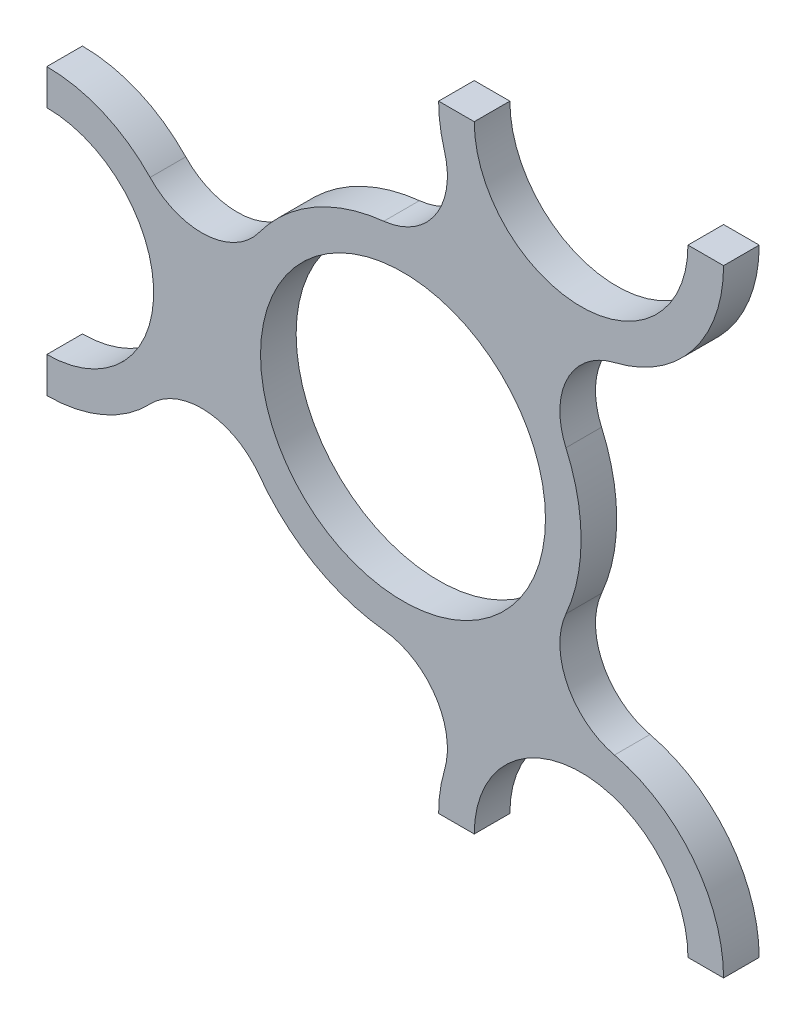
ISO-10303-21;
HEADER;
FILE_DESCRIPTION(('STEP AP214'),'2;1');
FILE_NAME('part.step','',(''),(''),'','','');
FILE_SCHEMA(('AUTOMOTIVE_DESIGN { 1 0 10303 214 1 1 1 1 }'));
ENDSEC;
DATA;
#1=APPLICATION_CONTEXT('core data for automotive mechanical design processes');
#2=APPLICATION_PROTOCOL_DEFINITION('international standard','automotive_design',2000,#1);
#3=PRODUCT_CONTEXT('',#1,'mechanical');
#4=PRODUCT('Part','Part','',(#3));
#5=PRODUCT_RELATED_PRODUCT_CATEGORY('part','',(#4));
#6=PRODUCT_DEFINITION_FORMATION('','',#4);
#7=PRODUCT_DEFINITION_CONTEXT('part definition',#1,'design');
#8=PRODUCT_DEFINITION('design','',#6,#7);
#9=PRODUCT_DEFINITION_SHAPE('','',#8);
#10=(LENGTH_UNIT() NAMED_UNIT(*) SI_UNIT(.MILLI.,.METRE.));
#11=(NAMED_UNIT(*) PLANE_ANGLE_UNIT() SI_UNIT($,.RADIAN.));
#12=(NAMED_UNIT(*) SI_UNIT($,.STERADIAN.) SOLID_ANGLE_UNIT());
#13=UNCERTAINTY_MEASURE_WITH_UNIT(LENGTH_MEASURE(1.E-05),#10,'distance_accuracy_value','');
#14=(GEOMETRIC_REPRESENTATION_CONTEXT(3) GLOBAL_UNCERTAINTY_ASSIGNED_CONTEXT((#13)) GLOBAL_UNIT_ASSIGNED_CONTEXT((#10,
#11,#12)) REPRESENTATION_CONTEXT('',''));
#15=CARTESIAN_POINT('',(0.,0.,0.));
#16=DIRECTION('',(0.,0.,1.));
#17=DIRECTION('',(1.,0.,0.));
#18=AXIS2_PLACEMENT_3D('',#15,#16,#17);
#19=CARTESIAN_POINT('',(-2.6495198984339,86.6,10.));
#20=DIRECTION('',(0.,0.,1.));
#21=DIRECTION('',(1.,0.,0.));
#22=AXIS2_PLACEMENT_3D('',#19,#20,#21);
#23=PLANE('',#22);
#24=CARTESIAN_POINT('',(-2.6495198984339,86.6,10.));
#25=DIRECTION('',(0.,0.,1.));
#26=DIRECTION('',(1.,0.,0.));
#27=AXIS2_PLACEMENT_3D('',#24,#25,#26);
#28=CIRCLE('',#27,40.);
#29=CARTESIAN_POINT('',(6.7101164463444,47.7104486077108,10.));
#30=VERTEX_POINT('',#29);
#31=CARTESIAN_POINT('',(37.3504801015661,86.6,10.));
#32=VERTEX_POINT('',#31);
#33=EDGE_CURVE('E276',#30,#32,#28,.T.);
#34=ORIENTED_EDGE('',*,*,#33,.T.);
#35=DIRECTION('',(-1.,0.,0.));
#36=VECTOR('',#35,1.);
#37=CARTESIAN_POINT('',(27.3504801015661,86.6,10.));
#38=LINE('',#37,#36);
#39=CARTESIAN_POINT('',(27.3504801015661,86.6,10.));
#40=VERTEX_POINT('',#39);
#41=EDGE_CURVE('E144',#32,#40,#38,.T.);
#42=ORIENTED_EDGE('',*,*,#41,.T.);
#43=CARTESIAN_POINT('',(-2.6495198984339,86.6,10.));
#44=DIRECTION('',(0.,0.,-1.));
#45=DIRECTION('',(1.,0.,0.));
#46=AXIS2_PLACEMENT_3D('',#43,#44,#45);
#47=CIRCLE('',#46,30.);
#48=CARTESIAN_POINT('',(-32.6495198984339,86.6,10.));
#49=VERTEX_POINT('',#48);
#50=EDGE_CURVE('E339',#40,#49,#47,.T.);
#51=ORIENTED_EDGE('',*,*,#50,.T.);
#52=DIRECTION('',(-1.,0.,0.));
#53=VECTOR('',#52,1.);
#54=CARTESIAN_POINT('',(-42.6495198984339,86.6,10.));
#55=LINE('',#54,#53);
#56=CARTESIAN_POINT('',(-42.6495198984339,86.6,10.));
#57=VERTEX_POINT('',#56);
#58=EDGE_CURVE('E358',#49,#57,#55,.T.);
#59=ORIENTED_EDGE('',*,*,#58,.T.);
#60=CARTESIAN_POINT('',(-2.6495198984339,86.6,10.));
#61=DIRECTION('',(0.,0.,1.));
#62=DIRECTION('',(1.,0.,0.));
#63=AXIS2_PLACEMENT_3D('',#60,#61,#62);
#64=CIRCLE('',#63,40.);
#65=CARTESIAN_POINT('',(-41.0089655681558,75.2618816414869,10.));
#66=VERTEX_POINT('',#65);
#67=EDGE_CURVE('E355',#57,#66,#64,.T.);
#68=ORIENTED_EDGE('',*,*,#67,.T.);
#69=CARTESIAN_POINT('',(-60.1886884030168,69.5928224622303,10.));
#70=DIRECTION('',(0.,0.,-1.));
#71=DIRECTION('',(1.,0.,0.));
#72=AXIS2_PLACEMENT_3D('',#69,#70,#71);
#73=CIRCLE('',#72,20.);
#74=CARTESIAN_POINT('',(-58.0346402588503,49.7091589015931,10.));
#75=VERTEX_POINT('',#74);
#76=EDGE_CURVE('E357',#66,#75,#73,.T.);
#77=ORIENTED_EDGE('',*,*,#76,.T.);
#78=CARTESIAN_POINT('',(-52.6495198984339,0.,10.));
#79=DIRECTION('',(0.,0.,1.));
#80=DIRECTION('',(1.,0.,0.));
#81=AXIS2_PLACEMENT_3D('',#78,#79,#80);
#82=CIRCLE('',#81,50.);
#83=CARTESIAN_POINT('',(-93.0066627555767,29.5178085299055,10.));
#84=VERTEX_POINT('',#83);
#85=EDGE_CURVE('E360',#75,#84,#82,.T.);
#86=ORIENTED_EDGE('',*,*,#85,.T.);
#87=CARTESIAN_POINT('',(-109.149519898434,41.3249319418678,10.));
#88=DIRECTION('',(0.,0.,-1.));
#89=DIRECTION('',(1.,0.,0.));
#90=AXIS2_PLACEMENT_3D('',#87,#88,#89);
#91=CIRCLE('',#90,20.);
#92=CARTESIAN_POINT('',(-123.649519898434,27.5499546279118,10.));
#93=VERTEX_POINT('',#92);
#94=EDGE_CURVE('E366',#84,#93,#91,.T.);
#95=ORIENTED_EDGE('',*,*,#94,.T.);
#96=CARTESIAN_POINT('',(-152.649519898434,0.,10.));
#97=DIRECTION('',(0.,0.,1.));
#98=DIRECTION('',(1.,0.,0.));
#99=AXIS2_PLACEMENT_3D('',#96,#97,#98);
#100=CIRCLE('',#99,40.);
#101=CARTESIAN_POINT('',(-152.649519898434,40.,10.));
#102=VERTEX_POINT('',#101);
#103=EDGE_CURVE('E368',#93,#102,#100,.T.);
#104=ORIENTED_EDGE('',*,*,#103,.T.);
#105=DIRECTION('',(0.,-1.,0.));
#106=VECTOR('',#105,1.);
#107=CARTESIAN_POINT('',(-152.649519898434,40.,10.));
#108=LINE('',#107,#106);
#109=CARTESIAN_POINT('',(-152.649519898434,30.,10.));
#110=VERTEX_POINT('',#109);
#111=EDGE_CURVE('E370',#102,#110,#108,.T.);
#112=ORIENTED_EDGE('',*,*,#111,.T.);
#113=CARTESIAN_POINT('',(-152.649519898434,0.,10.));
#114=DIRECTION('',(0.,0.,-1.));
#115=DIRECTION('',(1.,0.,0.));
#116=AXIS2_PLACEMENT_3D('',#113,#114,#115);
#117=CIRCLE('',#116,30.);
#118=CARTESIAN_POINT('',(-152.649519898434,-30.,10.));
#119=VERTEX_POINT('',#118);
#120=EDGE_CURVE('E372',#110,#119,#117,.T.);
#121=ORIENTED_EDGE('',*,*,#120,.T.);
#122=DIRECTION('',(0.,-1.,0.));
#123=VECTOR('',#122,1.);
#124=CARTESIAN_POINT('',(-152.649519898434,-30.,10.));
#125=LINE('',#124,#123);
#126=CARTESIAN_POINT('',(-152.649519898434,-40.,10.));
#127=VERTEX_POINT('',#126);
#128=EDGE_CURVE('E374',#119,#127,#125,.T.);
#129=ORIENTED_EDGE('',*,*,#128,.T.);
#130=CARTESIAN_POINT('',(-152.649519898434,0.,10.));
#131=DIRECTION('',(0.,0.,1.));
#132=DIRECTION('',(1.,0.,0.));
#133=AXIS2_PLACEMENT_3D('',#130,#131,#132);
#134=CIRCLE('',#133,40.);
#135=CARTESIAN_POINT('',(-123.649519898434,-27.5499546279118,10.));
#136=VERTEX_POINT('',#135);
#137=EDGE_CURVE('E376',#127,#136,#134,.T.);
#138=ORIENTED_EDGE('',*,*,#137,.T.);
#139=CARTESIAN_POINT('',(-109.149519898434,-41.3249319418678,10.));
#140=DIRECTION('',(0.,0.,-1.));
#141=DIRECTION('',(1.,0.,0.));
#142=AXIS2_PLACEMENT_3D('',#139,#140,#141);
#143=CIRCLE('',#142,20.);
#144=CARTESIAN_POINT('',(-93.0066627555767,-29.5178085299055,10.));
#145=VERTEX_POINT('',#144);
#146=EDGE_CURVE('E378',#136,#145,#143,.T.);
#147=ORIENTED_EDGE('',*,*,#146,.T.);
#148=CARTESIAN_POINT('',(-52.6495198984339,0.,10.));
#149=DIRECTION('',(0.,0.,1.));
#150=DIRECTION('',(1.,0.,0.));
#151=AXIS2_PLACEMENT_3D('',#148,#149,#150);
#152=CIRCLE('',#151,50.);
#153=CARTESIAN_POINT('',(-58.0346402588503,-49.7091589015931,10.));
#154=VERTEX_POINT('',#153);
#155=EDGE_CURVE('E380',#145,#154,#152,.T.);
#156=ORIENTED_EDGE('',*,*,#155,.T.);
#157=CARTESIAN_POINT('',(-60.1886884030168,-69.5928224622303,10.));
#158=DIRECTION('',(0.,0.,-1.));
#159=DIRECTION('',(-1.,0.,0.));
#160=AXIS2_PLACEMENT_3D('',#157,#158,#159);
#161=CIRCLE('',#160,20.);
#162=CARTESIAN_POINT('',(-41.0089655681558,-75.2618816414869,10.));
#163=VERTEX_POINT('',#162);
#164=EDGE_CURVE('E382',#154,#163,#161,.T.);
#165=ORIENTED_EDGE('',*,*,#164,.T.);
#166=CARTESIAN_POINT('',(-2.6495198984339,-86.6,10.));
#167=DIRECTION('',(0.,0.,1.));
#168=DIRECTION('',(-1.,0.,0.));
#169=AXIS2_PLACEMENT_3D('',#166,#167,#168);
#170=CIRCLE('',#169,40.);
#171=CARTESIAN_POINT('',(-42.6495198984339,-86.6,10.));
#172=VERTEX_POINT('',#171);
#173=EDGE_CURVE('E384',#163,#172,#170,.T.);
#174=ORIENTED_EDGE('',*,*,#173,.T.);
#175=DIRECTION('',(1.,0.,0.));
#176=VECTOR('',#175,1.);
#177=CARTESIAN_POINT('',(-42.6495198984339,-86.6,10.));
#178=LINE('',#177,#176);
#179=CARTESIAN_POINT('',(-32.6495198984339,-86.6,10.));
#180=VERTEX_POINT('',#179);
#181=EDGE_CURVE('E386',#172,#180,#178,.T.);
#182=ORIENTED_EDGE('',*,*,#181,.T.);
#183=CARTESIAN_POINT('',(-2.6495198984339,-86.6,10.));
#184=DIRECTION('',(0.,0.,-1.));
#185=DIRECTION('',(-1.,0.,0.));
#186=AXIS2_PLACEMENT_3D('',#183,#184,#185);
#187=CIRCLE('',#186,30.);
#188=CARTESIAN_POINT('',(27.3504801015661,-86.6,10.));
#189=VERTEX_POINT('',#188);
#190=EDGE_CURVE('E388',#180,#189,#187,.T.);
#191=ORIENTED_EDGE('',*,*,#190,.T.);
#192=DIRECTION('',(1.,0.,0.));
#193=VECTOR('',#192,1.);
#194=CARTESIAN_POINT('',(27.3504801015661,-86.6,10.));
#195=LINE('',#194,#193);
#196=CARTESIAN_POINT('',(37.3504801015661,-86.6,10.));
#197=VERTEX_POINT('',#196);
#198=EDGE_CURVE('E390',#189,#197,#195,.T.);
#199=ORIENTED_EDGE('',*,*,#198,.T.);
#200=CARTESIAN_POINT('',(-2.6495198984339,-86.6,10.));
#201=DIRECTION('',(0.,0.,1.));
#202=DIRECTION('',(-1.,0.,0.));
#203=AXIS2_PLACEMENT_3D('',#200,#201,#202);
#204=CIRCLE('',#203,40.);
#205=CARTESIAN_POINT('',(6.71011644634439,-47.7104486077108,10.));
#206=VERTEX_POINT('',#205);
#207=EDGE_CURVE('E211',#197,#206,#204,.T.);
#208=ORIENTED_EDGE('',*,*,#207,.T.);
#209=CARTESIAN_POINT('',(11.3899346187335,-28.2656729115661,10.));
#210=DIRECTION('',(0.,0.,-1.));
#211=DIRECTION('',(-1.,0.,0.));
#212=AXIS2_PLACEMENT_3D('',#209,#210,#211);
#213=CIRCLE('',#212,20.);
#214=CARTESIAN_POINT('',(-6.90705238617144,-20.1897663654044,10.));
#215=VERTEX_POINT('',#214);
#216=EDGE_CURVE('E205',#206,#215,#213,.T.);
#217=ORIENTED_EDGE('',*,*,#216,.T.);
#218=CARTESIAN_POINT('',(-52.6495198984339,0.,10.));
#219=DIRECTION('',(0.,0.,1.));
#220=DIRECTION('',(1.,0.,0.));
#221=AXIS2_PLACEMENT_3D('',#218,#219,#220);
#222=CIRCLE('',#221,50.);
#223=CARTESIAN_POINT('',(-6.90705238617144,20.1897663654044,10.));
#224=VERTEX_POINT('',#223);
#225=EDGE_CURVE('E209',#215,#224,#222,.T.);
#226=ORIENTED_EDGE('',*,*,#225,.T.);
#227=CARTESIAN_POINT('',(11.3899346187335,28.2656729115661,10.));
#228=DIRECTION('',(0.,0.,-1.));
#229=DIRECTION('',(1.,0.,0.));
#230=AXIS2_PLACEMENT_3D('',#227,#228,#229);
#231=CIRCLE('',#230,20.);
#232=EDGE_CURVE('E53',#224,#30,#231,.T.);
#233=ORIENTED_EDGE('',*,*,#232,.T.);
#234=EDGE_LOOP('',(#34,#42,#51,#59,#68,#77,#86,#95,#104,#112,#121,#129,#138,#147,#156,#165,#174,
#182,#191,#199,#208,#217,#226,#233));
#235=FACE_BOUND('',#234,.T.);
#236=CARTESIAN_POINT('',(-52.6495198984339,0.,10.));
#237=DIRECTION('',(0.,0.,1.));
#238=DIRECTION('',(1.,0.,0.));
#239=AXIS2_PLACEMENT_3D('',#236,#237,#238);
#240=CIRCLE('',#239,40.);
#241=CARTESIAN_POINT('',(-12.6495198984339,0.,10.));
#242=VERTEX_POINT('',#241);
#243=EDGE_CURVE('E233',#242,#242,#240,.T.);
#244=ORIENTED_EDGE('',*,*,#243,.F.);
#245=EDGE_LOOP('',(#244));
#246=FACE_BOUND('',#245,.T.);
#247=ADVANCED_FACE('F36',(#235,#246),#23,.T.);
#248=CARTESIAN_POINT('',(-2.6495198984339,86.6,0.));
#249=DIRECTION('',(0.,0.,1.));
#250=DIRECTION('',(1.,0.,0.));
#251=AXIS2_PLACEMENT_3D('',#248,#249,#250);
#252=PLANE('',#251);
#253=CARTESIAN_POINT('',(-2.6495198984339,86.6,0.));
#254=DIRECTION('',(0.,0.,1.));
#255=DIRECTION('',(1.,0.,0.));
#256=AXIS2_PLACEMENT_3D('',#253,#254,#255);
#257=CIRCLE('',#256,40.);
#258=CARTESIAN_POINT('',(6.7101164463444,47.7104486077108,0.));
#259=VERTEX_POINT('',#258);
#260=CARTESIAN_POINT('',(37.3504801015661,86.6,0.));
#261=VERTEX_POINT('',#260);
#262=EDGE_CURVE('E229',#259,#261,#257,.T.);
#263=ORIENTED_EDGE('',*,*,#262,.F.);
#264=CARTESIAN_POINT('',(11.3899346187335,28.2656729115661,0.));
#265=DIRECTION('',(0.,0.,-1.));
#266=DIRECTION('',(1.,0.,0.));
#267=AXIS2_PLACEMENT_3D('',#264,#265,#266);
#268=CIRCLE('',#267,20.);
#269=CARTESIAN_POINT('',(-6.90705238617144,20.1897663654044,0.));
#270=VERTEX_POINT('',#269);
#271=EDGE_CURVE('E136',#270,#259,#268,.T.);
#272=ORIENTED_EDGE('',*,*,#271,.F.);
#273=CARTESIAN_POINT('',(-52.6495198984339,0.,0.));
#274=DIRECTION('',(0.,0.,1.));
#275=DIRECTION('',(1.,0.,0.));
#276=AXIS2_PLACEMENT_3D('',#273,#274,#275);
#277=CIRCLE('',#276,50.);
#278=CARTESIAN_POINT('',(-6.90705238617144,-20.1897663654044,0.));
#279=VERTEX_POINT('',#278);
#280=EDGE_CURVE('E130',#279,#270,#277,.T.);
#281=ORIENTED_EDGE('',*,*,#280,.F.);
#282=CARTESIAN_POINT('',(11.3899346187335,-28.2656729115661,0.));
#283=DIRECTION('',(0.,0.,-1.));
#284=DIRECTION('',(-1.,0.,0.));
#285=AXIS2_PLACEMENT_3D('',#282,#283,#284);
#286=CIRCLE('',#285,20.);
#287=CARTESIAN_POINT('',(6.71011644634439,-47.7104486077108,0.));
#288=VERTEX_POINT('',#287);
#289=EDGE_CURVE('E219',#288,#279,#286,.T.);
#290=ORIENTED_EDGE('',*,*,#289,.F.);
#291=CARTESIAN_POINT('',(-2.6495198984339,-86.6,0.));
#292=DIRECTION('',(0.,0.,1.));
#293=DIRECTION('',(-1.,0.,0.));
#294=AXIS2_PLACEMENT_3D('',#291,#292,#293);
#295=CIRCLE('',#294,40.);
#296=CARTESIAN_POINT('',(37.3504801015661,-86.6,0.));
#297=VERTEX_POINT('',#296);
#298=EDGE_CURVE('E271',#297,#288,#295,.T.);
#299=ORIENTED_EDGE('',*,*,#298,.F.);
#300=DIRECTION('',(1.,0.,0.));
#301=VECTOR('',#300,1.);
#302=CARTESIAN_POINT('',(27.3504801015661,-86.6,0.));
#303=LINE('',#302,#301);
#304=CARTESIAN_POINT('',(27.3504801015661,-86.6,0.));
#305=VERTEX_POINT('',#304);
#306=EDGE_CURVE('E269',#305,#297,#303,.T.);
#307=ORIENTED_EDGE('',*,*,#306,.F.);
#308=CARTESIAN_POINT('',(-2.6495198984339,-86.6,0.));
#309=DIRECTION('',(0.,0.,-1.));
#310=DIRECTION('',(-1.,0.,0.));
#311=AXIS2_PLACEMENT_3D('',#308,#309,#310);
#312=CIRCLE('',#311,30.);
#313=CARTESIAN_POINT('',(-32.6495198984339,-86.6,0.));
#314=VERTEX_POINT('',#313);
#315=EDGE_CURVE('E267',#314,#305,#312,.T.);
#316=ORIENTED_EDGE('',*,*,#315,.F.);
#317=DIRECTION('',(1.,0.,0.));
#318=VECTOR('',#317,1.);
#319=CARTESIAN_POINT('',(-42.6495198984339,-86.6,0.));
#320=LINE('',#319,#318);
#321=CARTESIAN_POINT('',(-42.6495198984339,-86.6,0.));
#322=VERTEX_POINT('',#321);
#323=EDGE_CURVE('E265',#322,#314,#320,.T.);
#324=ORIENTED_EDGE('',*,*,#323,.F.);
#325=CARTESIAN_POINT('',(-2.6495198984339,-86.6,0.));
#326=DIRECTION('',(0.,0.,1.));
#327=DIRECTION('',(-1.,0.,0.));
#328=AXIS2_PLACEMENT_3D('',#325,#326,#327);
#329=CIRCLE('',#328,40.);
#330=CARTESIAN_POINT('',(-41.0089655681558,-75.2618816414869,0.));
#331=VERTEX_POINT('',#330);
#332=EDGE_CURVE('E263',#331,#322,#329,.T.);
#333=ORIENTED_EDGE('',*,*,#332,.F.);
#334=CARTESIAN_POINT('',(-60.1886884030168,-69.5928224622303,0.));
#335=DIRECTION('',(0.,0.,-1.));
#336=DIRECTION('',(-1.,0.,0.));
#337=AXIS2_PLACEMENT_3D('',#334,#335,#336);
#338=CIRCLE('',#337,20.);
#339=CARTESIAN_POINT('',(-58.0346402588503,-49.7091589015931,0.));
#340=VERTEX_POINT('',#339);
#341=EDGE_CURVE('E261',#340,#331,#338,.T.);
#342=ORIENTED_EDGE('',*,*,#341,.F.);
#343=CARTESIAN_POINT('',(-52.6495198984339,0.,0.));
#344=DIRECTION('',(0.,0.,1.));
#345=DIRECTION('',(1.,0.,0.));
#346=AXIS2_PLACEMENT_3D('',#343,#344,#345);
#347=CIRCLE('',#346,50.);
#348=CARTESIAN_POINT('',(-93.0066627555767,-29.5178085299055,0.));
#349=VERTEX_POINT('',#348);
#350=EDGE_CURVE('E259',#349,#340,#347,.T.);
#351=ORIENTED_EDGE('',*,*,#350,.F.);
#352=CARTESIAN_POINT('',(-109.149519898434,-41.3249319418678,0.));
#353=DIRECTION('',(0.,0.,-1.));
#354=DIRECTION('',(1.,0.,0.));
#355=AXIS2_PLACEMENT_3D('',#352,#353,#354);
#356=CIRCLE('',#355,20.);
#357=CARTESIAN_POINT('',(-123.649519898434,-27.5499546279118,0.));
#358=VERTEX_POINT('',#357);
#359=EDGE_CURVE('E257',#358,#349,#356,.T.);
#360=ORIENTED_EDGE('',*,*,#359,.F.);
#361=CARTESIAN_POINT('',(-152.649519898434,0.,0.));
#362=DIRECTION('',(0.,0.,1.));
#363=DIRECTION('',(1.,0.,0.));
#364=AXIS2_PLACEMENT_3D('',#361,#362,#363);
#365=CIRCLE('',#364,40.);
#366=CARTESIAN_POINT('',(-152.649519898434,-40.,0.));
#367=VERTEX_POINT('',#366);
#368=EDGE_CURVE('E255',#367,#358,#365,.T.);
#369=ORIENTED_EDGE('',*,*,#368,.F.);
#370=DIRECTION('',(0.,-1.,0.));
#371=VECTOR('',#370,1.);
#372=CARTESIAN_POINT('',(-152.649519898434,-30.,0.));
#373=LINE('',#372,#371);
#374=CARTESIAN_POINT('',(-152.649519898434,-30.,0.));
#375=VERTEX_POINT('',#374);
#376=EDGE_CURVE('E253',#375,#367,#373,.T.);
#377=ORIENTED_EDGE('',*,*,#376,.F.);
#378=CARTESIAN_POINT('',(-152.649519898434,0.,0.));
#379=DIRECTION('',(0.,0.,-1.));
#380=DIRECTION('',(1.,0.,0.));
#381=AXIS2_PLACEMENT_3D('',#378,#379,#380);
#382=CIRCLE('',#381,30.);
#383=CARTESIAN_POINT('',(-152.649519898434,30.,0.));
#384=VERTEX_POINT('',#383);
#385=EDGE_CURVE('E251',#384,#375,#382,.T.);
#386=ORIENTED_EDGE('',*,*,#385,.F.);
#387=DIRECTION('',(0.,-1.,0.));
#388=VECTOR('',#387,1.);
#389=CARTESIAN_POINT('',(-152.649519898434,40.,0.));
#390=LINE('',#389,#388);
#391=CARTESIAN_POINT('',(-152.649519898434,40.,0.));
#392=VERTEX_POINT('',#391);
#393=EDGE_CURVE('E249',#392,#384,#390,.T.);
#394=ORIENTED_EDGE('',*,*,#393,.F.);
#395=CARTESIAN_POINT('',(-152.649519898434,0.,0.));
#396=DIRECTION('',(0.,0.,1.));
#397=DIRECTION('',(1.,0.,0.));
#398=AXIS2_PLACEMENT_3D('',#395,#396,#397);
#399=CIRCLE('',#398,40.);
#400=CARTESIAN_POINT('',(-123.649519898434,27.5499546279118,0.));
#401=VERTEX_POINT('',#400);
#402=EDGE_CURVE('E247',#401,#392,#399,.T.);
#403=ORIENTED_EDGE('',*,*,#402,.F.);
#404=CARTESIAN_POINT('',(-109.149519898434,41.3249319418678,0.));
#405=DIRECTION('',(0.,0.,-1.));
#406=DIRECTION('',(1.,0.,0.));
#407=AXIS2_PLACEMENT_3D('',#404,#405,#406);
#408=CIRCLE('',#407,20.);
#409=CARTESIAN_POINT('',(-93.0066627555767,29.5178085299055,0.));
#410=VERTEX_POINT('',#409);
#411=EDGE_CURVE('E245',#410,#401,#408,.T.);
#412=ORIENTED_EDGE('',*,*,#411,.F.);
#413=CARTESIAN_POINT('',(-52.6495198984339,0.,0.));
#414=DIRECTION('',(0.,0.,1.));
#415=DIRECTION('',(1.,0.,0.));
#416=AXIS2_PLACEMENT_3D('',#413,#414,#415);
#417=CIRCLE('',#416,50.);
#418=CARTESIAN_POINT('',(-58.0346402588503,49.7091589015931,0.));
#419=VERTEX_POINT('',#418);
#420=EDGE_CURVE('E243',#419,#410,#417,.T.);
#421=ORIENTED_EDGE('',*,*,#420,.F.);
#422=CARTESIAN_POINT('',(-60.1886884030168,69.5928224622303,0.));
#423=DIRECTION('',(0.,0.,-1.));
#424=DIRECTION('',(1.,0.,0.));
#425=AXIS2_PLACEMENT_3D('',#422,#423,#424);
#426=CIRCLE('',#425,20.);
#427=CARTESIAN_POINT('',(-41.0089655681558,75.2618816414869,0.));
#428=VERTEX_POINT('',#427);
#429=EDGE_CURVE('E241',#428,#419,#426,.T.);
#430=ORIENTED_EDGE('',*,*,#429,.F.);
#431=CARTESIAN_POINT('',(-2.6495198984339,86.6,0.));
#432=DIRECTION('',(0.,0.,1.));
#433=DIRECTION('',(1.,0.,0.));
#434=AXIS2_PLACEMENT_3D('',#431,#432,#433);
#435=CIRCLE('',#434,40.);
#436=CARTESIAN_POINT('',(-42.6495198984339,86.6,0.));
#437=VERTEX_POINT('',#436);
#438=EDGE_CURVE('E239',#437,#428,#435,.T.);
#439=ORIENTED_EDGE('',*,*,#438,.F.);
#440=DIRECTION('',(-1.,0.,0.));
#441=VECTOR('',#440,1.);
#442=CARTESIAN_POINT('',(-42.6495198984339,86.6,0.));
#443=LINE('',#442,#441);
#444=CARTESIAN_POINT('',(-32.6495198984339,86.6,0.));
#445=VERTEX_POINT('',#444);
#446=EDGE_CURVE('E237',#445,#437,#443,.T.);
#447=ORIENTED_EDGE('',*,*,#446,.F.);
#448=CARTESIAN_POINT('',(-2.6495198984339,86.6,0.));
#449=DIRECTION('',(0.,0.,-1.));
#450=DIRECTION('',(1.,0.,0.));
#451=AXIS2_PLACEMENT_3D('',#448,#449,#450);
#452=CIRCLE('',#451,30.);
#453=CARTESIAN_POINT('',(27.3504801015661,86.6,0.));
#454=VERTEX_POINT('',#453);
#455=EDGE_CURVE('E235',#454,#445,#452,.T.);
#456=ORIENTED_EDGE('',*,*,#455,.F.);
#457=DIRECTION('',(-1.,0.,0.));
#458=VECTOR('',#457,1.);
#459=CARTESIAN_POINT('',(27.3504801015661,86.6,0.));
#460=LINE('',#459,#458);
#461=EDGE_CURVE('E232',#261,#454,#460,.T.);
#462=ORIENTED_EDGE('',*,*,#461,.F.);
#463=EDGE_LOOP('',(#263,#272,#281,#290,#299,#307,#316,#324,#333,#342,#351,#360,#369,#377,#386,
#394,#403,#412,#421,#430,#439,#447,#456,#462));
#464=FACE_BOUND('',#463,.T.);
#465=CARTESIAN_POINT('',(-52.6495198984339,0.,0.));
#466=DIRECTION('',(0.,0.,1.));
#467=DIRECTION('',(1.,0.,0.));
#468=AXIS2_PLACEMENT_3D('',#465,#466,#467);
#469=CIRCLE('',#468,40.);
#470=CARTESIAN_POINT('',(-12.6495198984339,0.,0.));
#471=VERTEX_POINT('',#470);
#472=EDGE_CURVE('E693',#471,#471,#469,.T.);
#473=ORIENTED_EDGE('',*,*,#472,.T.);
#474=EDGE_LOOP('',(#473));
#475=FACE_BOUND('',#474,.T.);
#476=ADVANCED_FACE('F343',(#464,#475),#252,.F.);
#477=CARTESIAN_POINT('',(-2.6495198984339,86.6,10.));
#478=DIRECTION('',(0.,0.,-1.));
#479=DIRECTION('',(-1.,0.,0.));
#480=AXIS2_PLACEMENT_3D('',#477,#478,#479);
#481=CYLINDRICAL_SURFACE('',#480,40.);
#482=ORIENTED_EDGE('',*,*,#262,.T.);
#483=DIRECTION('',(0.,0.,-1.));
#484=VECTOR('',#483,1.);
#485=CARTESIAN_POINT('',(37.3504801015661,86.6,10.));
#486=LINE('',#485,#484);
#487=EDGE_CURVE('E11',#32,#261,#486,.T.);
#488=ORIENTED_EDGE('',*,*,#487,.F.);
#489=ORIENTED_EDGE('',*,*,#33,.F.);
#490=DIRECTION('',(0.,0.,-1.));
#491=VECTOR('',#490,1.);
#492=CARTESIAN_POINT('',(6.7101164463444,47.7104486077108,10.));
#493=LINE('',#492,#491);
#494=EDGE_CURVE('E225',#30,#259,#493,.T.);
#495=ORIENTED_EDGE('',*,*,#494,.T.);
#496=EDGE_LOOP('',(#482,#488,#489,#495));
#497=FACE_BOUND('',#496,.T.);
#498=ADVANCED_FACE('F38',(#497),#481,.T.);
#499=CARTESIAN_POINT('',(27.3504801015661,86.6,10.));
#500=DIRECTION('',(0.,-1.,0.));
#501=DIRECTION('',(0.,0.,-1.));
#502=AXIS2_PLACEMENT_3D('',#499,#500,#501);
#503=PLANE('',#502);
#504=ORIENTED_EDGE('',*,*,#461,.T.);
#505=DIRECTION('',(0.,0.,-1.));
#506=VECTOR('',#505,1.);
#507=CARTESIAN_POINT('',(27.3504801015661,86.6,10.));
#508=LINE('',#507,#506);
#509=EDGE_CURVE('E45',#40,#454,#508,.T.);
#510=ORIENTED_EDGE('',*,*,#509,.F.);
#511=ORIENTED_EDGE('',*,*,#41,.F.);
#512=ORIENTED_EDGE('',*,*,#487,.T.);
#513=EDGE_LOOP('',(#504,#510,#511,#512));
#514=FACE_BOUND('',#513,.T.);
#515=ADVANCED_FACE('F424',(#514),#503,.F.);
#516=CARTESIAN_POINT('',(-2.6495198984339,86.6,10.));
#517=DIRECTION('',(0.,0.,-1.));
#518=DIRECTION('',(-1.,0.,0.));
#519=AXIS2_PLACEMENT_3D('',#516,#517,#518);
#520=CYLINDRICAL_SURFACE('',#519,30.);
#521=ORIENTED_EDGE('',*,*,#455,.T.);
#522=DIRECTION('',(0.,0.,-1.));
#523=VECTOR('',#522,1.);
#524=CARTESIAN_POINT('',(-32.6495198984339,86.6,10.));
#525=LINE('',#524,#523);
#526=EDGE_CURVE('E331',#49,#445,#525,.T.);
#527=ORIENTED_EDGE('',*,*,#526,.F.);
#528=ORIENTED_EDGE('',*,*,#50,.F.);
#529=ORIENTED_EDGE('',*,*,#509,.T.);
#530=EDGE_LOOP('',(#521,#527,#528,#529));
#531=FACE_BOUND('',#530,.T.);
#532=ADVANCED_FACE('F337',(#531),#520,.F.);
#533=CARTESIAN_POINT('',(-42.6495198984339,86.6,10.));
#534=DIRECTION('',(0.,-1.,0.));
#535=DIRECTION('',(0.,0.,-1.));
#536=AXIS2_PLACEMENT_3D('',#533,#534,#535);
#537=PLANE('',#536);
#538=ORIENTED_EDGE('',*,*,#446,.T.);
#539=DIRECTION('',(0.,0.,-1.));
#540=VECTOR('',#539,1.);
#541=CARTESIAN_POINT('',(-42.6495198984339,86.6,10.));
#542=LINE('',#541,#540);
#543=EDGE_CURVE('E328',#57,#437,#542,.T.);
#544=ORIENTED_EDGE('',*,*,#543,.F.);
#545=ORIENTED_EDGE('',*,*,#58,.F.);
#546=ORIENTED_EDGE('',*,*,#526,.T.);
#547=EDGE_LOOP('',(#538,#544,#545,#546));
#548=FACE_BOUND('',#547,.T.);
#549=ADVANCED_FACE('F349',(#548),#537,.F.);
#550=CARTESIAN_POINT('',(-2.6495198984339,86.6,10.));
#551=DIRECTION('',(0.,0.,-1.));
#552=DIRECTION('',(-1.,0.,0.));
#553=AXIS2_PLACEMENT_3D('',#550,#551,#552);
#554=CYLINDRICAL_SURFACE('',#553,40.);
#555=ORIENTED_EDGE('',*,*,#438,.T.);
#556=DIRECTION('',(0.,0.,-1.));
#557=VECTOR('',#556,1.);
#558=CARTESIAN_POINT('',(-41.0089655681558,75.2618816414869,10.));
#559=LINE('',#558,#557);
#560=EDGE_CURVE('E325',#66,#428,#559,.T.);
#561=ORIENTED_EDGE('',*,*,#560,.F.);
#562=ORIENTED_EDGE('',*,*,#67,.F.);
#563=ORIENTED_EDGE('',*,*,#543,.T.);
#564=EDGE_LOOP('',(#555,#561,#562,#563));
#565=FACE_BOUND('',#564,.T.);
#566=ADVANCED_FACE('F353',(#565),#554,.T.);
#567=CARTESIAN_POINT('',(-60.1886884030168,69.5928224622303,10.));
#568=DIRECTION('',(0.,0.,-1.));
#569=DIRECTION('',(-1.,0.,0.));
#570=AXIS2_PLACEMENT_3D('',#567,#568,#569);
#571=CYLINDRICAL_SURFACE('',#570,20.);
#572=ORIENTED_EDGE('',*,*,#429,.T.);
#573=DIRECTION('',(0.,0.,-1.));
#574=VECTOR('',#573,1.);
#575=CARTESIAN_POINT('',(-58.0346402588503,49.7091589015931,10.));
#576=LINE('',#575,#574);
#577=EDGE_CURVE('E322',#75,#419,#576,.T.);
#578=ORIENTED_EDGE('',*,*,#577,.F.);
#579=ORIENTED_EDGE('',*,*,#76,.F.);
#580=ORIENTED_EDGE('',*,*,#560,.T.);
#581=EDGE_LOOP('',(#572,#578,#579,#580));
#582=FACE_BOUND('',#581,.T.);
#583=ADVANCED_FACE('F437',(#582),#571,.F.);
#584=CARTESIAN_POINT('',(-52.6495198984339,0.,10.));
#585=DIRECTION('',(0.,0.,-1.));
#586=DIRECTION('',(-1.,0.,0.));
#587=AXIS2_PLACEMENT_3D('',#584,#585,#586);
#588=CYLINDRICAL_SURFACE('',#587,50.);
#589=ORIENTED_EDGE('',*,*,#420,.T.);
#590=DIRECTION('',(0.,0.,-1.));
#591=VECTOR('',#590,1.);
#592=CARTESIAN_POINT('',(-93.0066627555767,29.5178085299055,10.));
#593=LINE('',#592,#591);
#594=EDGE_CURVE('E319',#84,#410,#593,.T.);
#595=ORIENTED_EDGE('',*,*,#594,.F.);
#596=ORIENTED_EDGE('',*,*,#85,.F.);
#597=ORIENTED_EDGE('',*,*,#577,.T.);
#598=EDGE_LOOP('',(#589,#595,#596,#597));
#599=FACE_BOUND('',#598,.T.);
#600=ADVANCED_FACE('F440',(#599),#588,.T.);
#601=CARTESIAN_POINT('',(-109.149519898434,41.3249319418678,10.));
#602=DIRECTION('',(0.,0.,-1.));
#603=DIRECTION('',(-1.,0.,0.));
#604=AXIS2_PLACEMENT_3D('',#601,#602,#603);
#605=CYLINDRICAL_SURFACE('',#604,20.);
#606=ORIENTED_EDGE('',*,*,#411,.T.);
#607=DIRECTION('',(0.,0.,-1.));
#608=VECTOR('',#607,1.);
#609=CARTESIAN_POINT('',(-123.649519898434,27.5499546279118,10.));
#610=LINE('',#609,#608);
#611=EDGE_CURVE('E316',#93,#401,#610,.T.);
#612=ORIENTED_EDGE('',*,*,#611,.F.);
#613=ORIENTED_EDGE('',*,*,#94,.F.);
#614=ORIENTED_EDGE('',*,*,#594,.T.);
#615=EDGE_LOOP('',(#606,#612,#613,#614));
#616=FACE_BOUND('',#615,.T.);
#617=ADVANCED_FACE('F444',(#616),#605,.F.);
#618=CARTESIAN_POINT('',(-152.649519898434,0.,10.));
#619=DIRECTION('',(0.,0.,-1.));
#620=DIRECTION('',(-1.,0.,0.));
#621=AXIS2_PLACEMENT_3D('',#618,#619,#620);
#622=CYLINDRICAL_SURFACE('',#621,40.);
#623=ORIENTED_EDGE('',*,*,#402,.T.);
#624=DIRECTION('',(0.,0.,-1.));
#625=VECTOR('',#624,1.);
#626=CARTESIAN_POINT('',(-152.649519898434,40.,10.));
#627=LINE('',#626,#625);
#628=EDGE_CURVE('E313',#102,#392,#627,.T.);
#629=ORIENTED_EDGE('',*,*,#628,.F.);
#630=ORIENTED_EDGE('',*,*,#103,.F.);
#631=ORIENTED_EDGE('',*,*,#611,.T.);
#632=EDGE_LOOP('',(#623,#629,#630,#631));
#633=FACE_BOUND('',#632,.T.);
#634=ADVANCED_FACE('F448',(#633),#622,.T.);
#635=CARTESIAN_POINT('',(-152.649519898434,40.,10.));
#636=DIRECTION('',(1.,0.,0.));
#637=DIRECTION('',(0.,0.,-1.));
#638=AXIS2_PLACEMENT_3D('',#635,#636,#637);
#639=PLANE('',#638);
#640=ORIENTED_EDGE('',*,*,#393,.T.);
#641=DIRECTION('',(0.,0.,-1.));
#642=VECTOR('',#641,1.);
#643=CARTESIAN_POINT('',(-152.649519898434,30.,10.));
#644=LINE('',#643,#642);
#645=EDGE_CURVE('E310',#110,#384,#644,.T.);
#646=ORIENTED_EDGE('',*,*,#645,.F.);
#647=ORIENTED_EDGE('',*,*,#111,.F.);
#648=ORIENTED_EDGE('',*,*,#628,.T.);
#649=EDGE_LOOP('',(#640,#646,#647,#648));
#650=FACE_BOUND('',#649,.T.);
#651=ADVANCED_FACE('F452',(#650),#639,.F.);
#652=CARTESIAN_POINT('',(-152.649519898434,0.,10.));
#653=DIRECTION('',(0.,0.,-1.));
#654=DIRECTION('',(-1.,0.,0.));
#655=AXIS2_PLACEMENT_3D('',#652,#653,#654);
#656=CYLINDRICAL_SURFACE('',#655,30.);
#657=ORIENTED_EDGE('',*,*,#385,.T.);
#658=DIRECTION('',(0.,0.,-1.));
#659=VECTOR('',#658,1.);
#660=CARTESIAN_POINT('',(-152.649519898434,-30.,10.));
#661=LINE('',#660,#659);
#662=EDGE_CURVE('E307',#119,#375,#661,.T.);
#663=ORIENTED_EDGE('',*,*,#662,.F.);
#664=ORIENTED_EDGE('',*,*,#120,.F.);
#665=ORIENTED_EDGE('',*,*,#645,.T.);
#666=EDGE_LOOP('',(#657,#663,#664,#665));
#667=FACE_BOUND('',#666,.T.);
#668=ADVANCED_FACE('F456',(#667),#656,.F.);
#669=CARTESIAN_POINT('',(-152.649519898434,-30.,10.));
#670=DIRECTION('',(1.,0.,0.));
#671=DIRECTION('',(0.,0.,-1.));
#672=AXIS2_PLACEMENT_3D('',#669,#670,#671);
#673=PLANE('',#672);
#674=ORIENTED_EDGE('',*,*,#376,.T.);
#675=DIRECTION('',(0.,0.,-1.));
#676=VECTOR('',#675,1.);
#677=CARTESIAN_POINT('',(-152.649519898434,-40.,10.));
#678=LINE('',#677,#676);
#679=EDGE_CURVE('E304',#127,#367,#678,.T.);
#680=ORIENTED_EDGE('',*,*,#679,.F.);
#681=ORIENTED_EDGE('',*,*,#128,.F.);
#682=ORIENTED_EDGE('',*,*,#662,.T.);
#683=EDGE_LOOP('',(#674,#680,#681,#682));
#684=FACE_BOUND('',#683,.T.);
#685=ADVANCED_FACE('F460',(#684),#673,.F.);
#686=CARTESIAN_POINT('',(-152.649519898434,0.,10.));
#687=DIRECTION('',(0.,0.,-1.));
#688=DIRECTION('',(-1.,0.,0.));
#689=AXIS2_PLACEMENT_3D('',#686,#687,#688);
#690=CYLINDRICAL_SURFACE('',#689,40.);
#691=ORIENTED_EDGE('',*,*,#368,.T.);
#692=DIRECTION('',(0.,0.,-1.));
#693=VECTOR('',#692,1.);
#694=CARTESIAN_POINT('',(-123.649519898434,-27.5499546279118,10.));
#695=LINE('',#694,#693);
#696=EDGE_CURVE('E301',#136,#358,#695,.T.);
#697=ORIENTED_EDGE('',*,*,#696,.F.);
#698=ORIENTED_EDGE('',*,*,#137,.F.);
#699=ORIENTED_EDGE('',*,*,#679,.T.);
#700=EDGE_LOOP('',(#691,#697,#698,#699));
#701=FACE_BOUND('',#700,.T.);
#702=ADVANCED_FACE('F464',(#701),#690,.T.);
#703=CARTESIAN_POINT('',(-109.149519898434,-41.3249319418678,10.));
#704=DIRECTION('',(0.,0.,-1.));
#705=DIRECTION('',(-1.,0.,0.));
#706=AXIS2_PLACEMENT_3D('',#703,#704,#705);
#707=CYLINDRICAL_SURFACE('',#706,20.);
#708=ORIENTED_EDGE('',*,*,#359,.T.);
#709=DIRECTION('',(0.,0.,-1.));
#710=VECTOR('',#709,1.);
#711=CARTESIAN_POINT('',(-93.0066627555767,-29.5178085299055,10.));
#712=LINE('',#711,#710);
#713=EDGE_CURVE('E298',#145,#349,#712,.T.);
#714=ORIENTED_EDGE('',*,*,#713,.F.);
#715=ORIENTED_EDGE('',*,*,#146,.F.);
#716=ORIENTED_EDGE('',*,*,#696,.T.);
#717=EDGE_LOOP('',(#708,#714,#715,#716));
#718=FACE_BOUND('',#717,.T.);
#719=ADVANCED_FACE('F468',(#718),#707,.F.);
#720=CARTESIAN_POINT('',(-52.6495198984339,0.,10.));
#721=DIRECTION('',(0.,0.,-1.));
#722=DIRECTION('',(-1.,0.,0.));
#723=AXIS2_PLACEMENT_3D('',#720,#721,#722);
#724=CYLINDRICAL_SURFACE('',#723,50.);
#725=ORIENTED_EDGE('',*,*,#350,.T.);
#726=DIRECTION('',(0.,0.,-1.));
#727=VECTOR('',#726,1.);
#728=CARTESIAN_POINT('',(-58.0346402588503,-49.7091589015931,10.));
#729=LINE('',#728,#727);
#730=EDGE_CURVE('E295',#154,#340,#729,.T.);
#731=ORIENTED_EDGE('',*,*,#730,.F.);
#732=ORIENTED_EDGE('',*,*,#155,.F.);
#733=ORIENTED_EDGE('',*,*,#713,.T.);
#734=EDGE_LOOP('',(#725,#731,#732,#733));
#735=FACE_BOUND('',#734,.T.);
#736=ADVANCED_FACE('F472',(#735),#724,.T.);
#737=CARTESIAN_POINT('',(-60.1886884030168,-69.5928224622303,10.));
#738=DIRECTION('',(0.,0.,-1.));
#739=DIRECTION('',(-1.,0.,0.));
#740=AXIS2_PLACEMENT_3D('',#737,#738,#739);
#741=CYLINDRICAL_SURFACE('',#740,20.);
#742=ORIENTED_EDGE('',*,*,#341,.T.);
#743=DIRECTION('',(0.,0.,-1.));
#744=VECTOR('',#743,1.);
#745=CARTESIAN_POINT('',(-41.0089655681558,-75.2618816414869,10.));
#746=LINE('',#745,#744);
#747=EDGE_CURVE('E292',#163,#331,#746,.T.);
#748=ORIENTED_EDGE('',*,*,#747,.F.);
#749=ORIENTED_EDGE('',*,*,#164,.F.);
#750=ORIENTED_EDGE('',*,*,#730,.T.);
#751=EDGE_LOOP('',(#742,#748,#749,#750));
#752=FACE_BOUND('',#751,.T.);
#753=ADVANCED_FACE('F476',(#752),#741,.F.);
#754=CARTESIAN_POINT('',(-2.6495198984339,-86.6,10.));
#755=DIRECTION('',(0.,0.,-1.));
#756=DIRECTION('',(-1.,0.,0.));
#757=AXIS2_PLACEMENT_3D('',#754,#755,#756);
#758=CYLINDRICAL_SURFACE('',#757,40.);
#759=ORIENTED_EDGE('',*,*,#332,.T.);
#760=DIRECTION('',(0.,0.,-1.));
#761=VECTOR('',#760,1.);
#762=CARTESIAN_POINT('',(-42.6495198984339,-86.6,10.));
#763=LINE('',#762,#761);
#764=EDGE_CURVE('E289',#172,#322,#763,.T.);
#765=ORIENTED_EDGE('',*,*,#764,.F.);
#766=ORIENTED_EDGE('',*,*,#173,.F.);
#767=ORIENTED_EDGE('',*,*,#747,.T.);
#768=EDGE_LOOP('',(#759,#765,#766,#767));
#769=FACE_BOUND('',#768,.T.);
#770=ADVANCED_FACE('F480',(#769),#758,.T.);
#771=CARTESIAN_POINT('',(-42.6495198984339,-86.6,10.));
#772=DIRECTION('',(0.,1.,0.));
#773=DIRECTION('',(0.,0.,1.));
#774=AXIS2_PLACEMENT_3D('',#771,#772,#773);
#775=PLANE('',#774);
#776=ORIENTED_EDGE('',*,*,#323,.T.);
#777=DIRECTION('',(0.,0.,-1.));
#778=VECTOR('',#777,1.);
#779=CARTESIAN_POINT('',(-32.6495198984339,-86.6,10.));
#780=LINE('',#779,#778);
#781=EDGE_CURVE('E286',#180,#314,#780,.T.);
#782=ORIENTED_EDGE('',*,*,#781,.F.);
#783=ORIENTED_EDGE('',*,*,#181,.F.);
#784=ORIENTED_EDGE('',*,*,#764,.T.);
#785=EDGE_LOOP('',(#776,#782,#783,#784));
#786=FACE_BOUND('',#785,.T.);
#787=ADVANCED_FACE('F484',(#786),#775,.F.);
#788=CARTESIAN_POINT('',(-2.6495198984339,-86.6,10.));
#789=DIRECTION('',(0.,0.,-1.));
#790=DIRECTION('',(-1.,0.,0.));
#791=AXIS2_PLACEMENT_3D('',#788,#789,#790);
#792=CYLINDRICAL_SURFACE('',#791,30.);
#793=ORIENTED_EDGE('',*,*,#315,.T.);
#794=DIRECTION('',(0.,0.,-1.));
#795=VECTOR('',#794,1.);
#796=CARTESIAN_POINT('',(27.3504801015661,-86.6,10.));
#797=LINE('',#796,#795);
#798=EDGE_CURVE('E283',#189,#305,#797,.T.);
#799=ORIENTED_EDGE('',*,*,#798,.F.);
#800=ORIENTED_EDGE('',*,*,#190,.F.);
#801=ORIENTED_EDGE('',*,*,#781,.T.);
#802=EDGE_LOOP('',(#793,#799,#800,#801));
#803=FACE_BOUND('',#802,.T.);
#804=ADVANCED_FACE('F488',(#803),#792,.F.);
#805=CARTESIAN_POINT('',(27.3504801015661,-86.6,10.));
#806=DIRECTION('',(0.,1.,0.));
#807=DIRECTION('',(0.,0.,1.));
#808=AXIS2_PLACEMENT_3D('',#805,#806,#807);
#809=PLANE('',#808);
#810=ORIENTED_EDGE('',*,*,#306,.T.);
#811=DIRECTION('',(0.,0.,-1.));
#812=VECTOR('',#811,1.);
#813=CARTESIAN_POINT('',(37.3504801015661,-86.6,10.));
#814=LINE('',#813,#812);
#815=EDGE_CURVE('E280',#197,#297,#814,.T.);
#816=ORIENTED_EDGE('',*,*,#815,.F.);
#817=ORIENTED_EDGE('',*,*,#198,.F.);
#818=ORIENTED_EDGE('',*,*,#798,.T.);
#819=EDGE_LOOP('',(#810,#816,#817,#818));
#820=FACE_BOUND('',#819,.T.);
#821=ADVANCED_FACE('F396',(#820),#809,.F.);
#822=CARTESIAN_POINT('',(-2.6495198984339,-86.6,10.));
#823=DIRECTION('',(0.,0.,-1.));
#824=DIRECTION('',(-1.,0.,0.));
#825=AXIS2_PLACEMENT_3D('',#822,#823,#824);
#826=CYLINDRICAL_SURFACE('',#825,40.);
#827=ORIENTED_EDGE('',*,*,#298,.T.);
#828=DIRECTION('',(0.,0.,-1.));
#829=VECTOR('',#828,1.);
#830=CARTESIAN_POINT('',(6.71011644634439,-47.7104486077108,10.));
#831=LINE('',#830,#829);
#832=EDGE_CURVE('E220',#206,#288,#831,.T.);
#833=ORIENTED_EDGE('',*,*,#832,.F.);
#834=ORIENTED_EDGE('',*,*,#207,.F.);
#835=ORIENTED_EDGE('',*,*,#815,.T.);
#836=EDGE_LOOP('',(#827,#833,#834,#835));
#837=FACE_BOUND('',#836,.T.);
#838=ADVANCED_FACE('F400',(#837),#826,.T.);
#839=CARTESIAN_POINT('',(11.3899346187335,-28.2656729115661,10.));
#840=DIRECTION('',(0.,0.,-1.));
#841=DIRECTION('',(-1.,0.,0.));
#842=AXIS2_PLACEMENT_3D('',#839,#840,#841);
#843=CYLINDRICAL_SURFACE('',#842,20.);
#844=ORIENTED_EDGE('',*,*,#289,.T.);
#845=DIRECTION('',(0.,0.,-1.));
#846=VECTOR('',#845,1.);
#847=CARTESIAN_POINT('',(-6.90705238617144,-20.1897663654044,10.));
#848=LINE('',#847,#846);
#849=EDGE_CURVE('E216',#215,#279,#848,.T.);
#850=ORIENTED_EDGE('',*,*,#849,.F.);
#851=ORIENTED_EDGE('',*,*,#216,.F.);
#852=ORIENTED_EDGE('',*,*,#832,.T.);
#853=EDGE_LOOP('',(#844,#850,#851,#852));
#854=FACE_BOUND('',#853,.T.);
#855=ADVANCED_FACE('F217',(#854),#843,.F.);
#856=CARTESIAN_POINT('',(-52.6495198984339,0.,10.));
#857=DIRECTION('',(0.,0.,-1.));
#858=DIRECTION('',(-1.,0.,0.));
#859=AXIS2_PLACEMENT_3D('',#856,#857,#858);
#860=CYLINDRICAL_SURFACE('',#859,50.);
#861=ORIENTED_EDGE('',*,*,#280,.T.);
#862=DIRECTION('',(0.,0.,-1.));
#863=VECTOR('',#862,1.);
#864=CARTESIAN_POINT('',(-6.90705238617144,20.1897663654044,10.));
#865=LINE('',#864,#863);
#866=EDGE_CURVE('E221',#224,#270,#865,.T.);
#867=ORIENTED_EDGE('',*,*,#866,.F.);
#868=ORIENTED_EDGE('',*,*,#225,.F.);
#869=ORIENTED_EDGE('',*,*,#849,.T.);
#870=EDGE_LOOP('',(#861,#867,#868,#869));
#871=FACE_BOUND('',#870,.T.);
#872=ADVANCED_FACE('F223',(#871),#860,.T.);
#873=CARTESIAN_POINT('',(11.3899346187335,28.2656729115661,10.));
#874=DIRECTION('',(0.,0.,-1.));
#875=DIRECTION('',(-1.,0.,0.));
#876=AXIS2_PLACEMENT_3D('',#873,#874,#875);
#877=CYLINDRICAL_SURFACE('',#876,20.);
#878=ORIENTED_EDGE('',*,*,#271,.T.);
#879=ORIENTED_EDGE('',*,*,#494,.F.);
#880=ORIENTED_EDGE('',*,*,#232,.F.);
#881=ORIENTED_EDGE('',*,*,#866,.T.);
#882=EDGE_LOOP('',(#878,#879,#880,#881));
#883=FACE_BOUND('',#882,.T.);
#884=ADVANCED_FACE('F404',(#883),#877,.F.);
#885=CARTESIAN_POINT('',(-52.6495198984339,0.,10.));
#886=DIRECTION('',(0.,0.,-1.));
#887=DIRECTION('',(-1.,0.,0.));
#888=AXIS2_PLACEMENT_3D('',#885,#886,#887);
#889=CYLINDRICAL_SURFACE('',#888,40.);
#890=ORIENTED_EDGE('',*,*,#243,.T.);
#891=EDGE_LOOP('',(#890));
#892=FACE_BOUND('',#891,.T.);
#893=ORIENTED_EDGE('',*,*,#472,.F.);
#894=EDGE_LOOP('',(#893));
#895=FACE_BOUND('',#894,.T.);
#896=ADVANCED_FACE('F406',(#892,#895),#889,.F.);
#897=CLOSED_SHELL('',(#247,#476,#498,#515,#532,#549,#566,#583,#600,#617,#634,#651,#668,#685,
#702,#719,#736,#753,#770,#787,#804,#821,#838,#855,#872,#884,#896));
#898=MANIFOLD_SOLID_BREP('B2',#897);
#899=ADVANCED_BREP_SHAPE_REPRESENTATION('',(#18,#898),#14);
#900=SHAPE_DEFINITION_REPRESENTATION(#9,#899);
ENDSEC;
END-ISO-10303-21;
